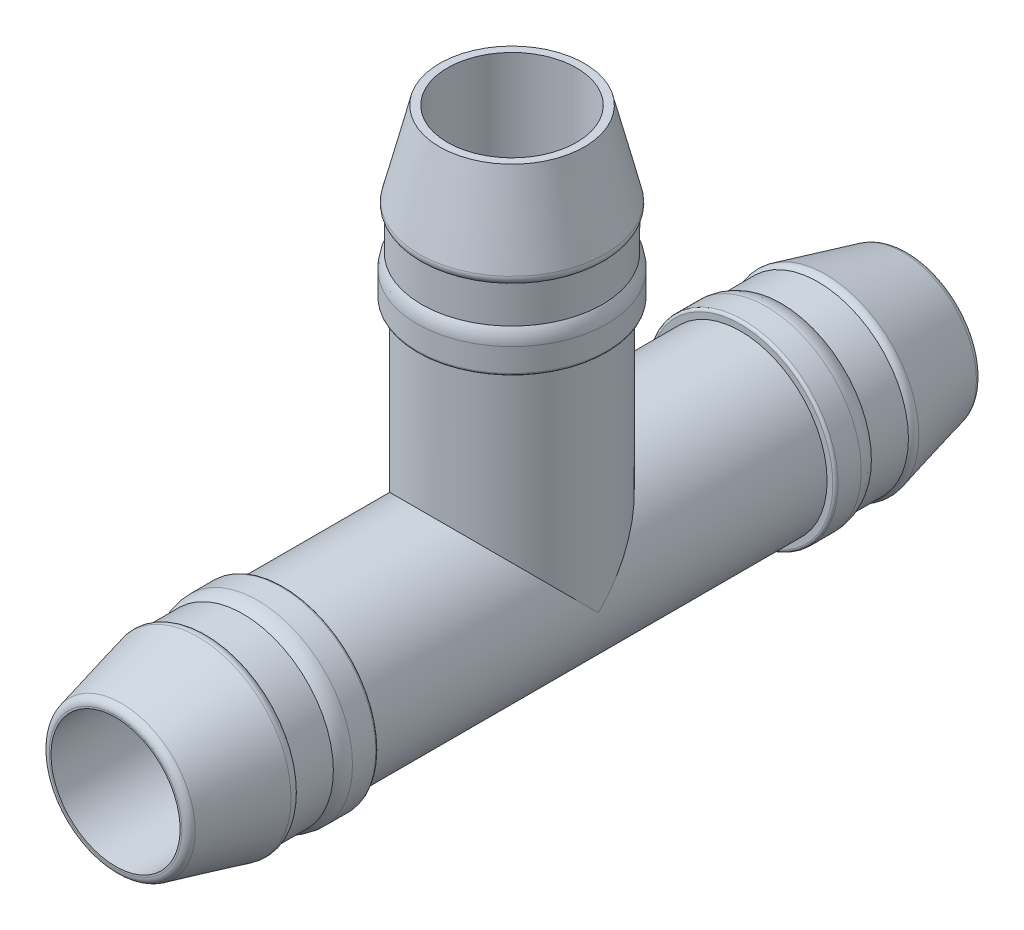
ISO-10303-21;
HEADER;
FILE_DESCRIPTION(('STEP AP214'),'2;1');
FILE_NAME('part.step','',(''),(''),'','','');
FILE_SCHEMA(('AUTOMOTIVE_DESIGN { 1 0 10303 214 1 1 1 1 }'));
ENDSEC;
DATA;
#1=APPLICATION_CONTEXT('core data for automotive mechanical design processes');
#2=APPLICATION_PROTOCOL_DEFINITION('international standard','automotive_design',2000,#1);
#3=PRODUCT_CONTEXT('',#1,'mechanical');
#4=PRODUCT('Part','Part','',(#3));
#5=PRODUCT_RELATED_PRODUCT_CATEGORY('part','',(#4));
#6=PRODUCT_DEFINITION_FORMATION('','',#4);
#7=PRODUCT_DEFINITION_CONTEXT('part definition',#1,'design');
#8=PRODUCT_DEFINITION('design','',#6,#7);
#9=PRODUCT_DEFINITION_SHAPE('','',#8);
#10=(LENGTH_UNIT() NAMED_UNIT(*) SI_UNIT(.MILLI.,.METRE.));
#11=(NAMED_UNIT(*) PLANE_ANGLE_UNIT() SI_UNIT($,.RADIAN.));
#12=(NAMED_UNIT(*) SI_UNIT($,.STERADIAN.) SOLID_ANGLE_UNIT());
#13=UNCERTAINTY_MEASURE_WITH_UNIT(LENGTH_MEASURE(1.E-05),#10,'distance_accuracy_value','');
#14=(GEOMETRIC_REPRESENTATION_CONTEXT(3) GLOBAL_UNCERTAINTY_ASSIGNED_CONTEXT((#13)) GLOBAL_UNIT_ASSIGNED_CONTEXT((#10,
#11,#12)) REPRESENTATION_CONTEXT('',''));
#15=CARTESIAN_POINT('',(0.,0.,0.));
#16=DIRECTION('',(0.,0.,1.));
#17=DIRECTION('',(1.,0.,0.));
#18=AXIS2_PLACEMENT_3D('',#15,#16,#17);
#19=CARTESIAN_POINT('',(0.,0.,-8.85));
#20=DIRECTION('',(0.,0.,1.));
#21=DIRECTION('',(1.,0.,0.));
#22=AXIS2_PLACEMENT_3D('',#19,#20,#21);
#23=CYLINDRICAL_SURFACE('',#22,3.35);
#24=CARTESIAN_POINT('',(0.,0.,-8.85));
#25=DIRECTION('',(0.,0.,1.));
#26=DIRECTION('',(1.,0.,0.));
#27=AXIS2_PLACEMENT_3D('',#24,#25,#26);
#28=CIRCLE('',#27,3.35);
#29=CARTESIAN_POINT('',(3.35,0.,-8.85));
#30=VERTEX_POINT('',#29);
#31=EDGE_CURVE('E91',#30,#30,#28,.T.);
#32=ORIENTED_EDGE('',*,*,#31,.T.);
#33=EDGE_LOOP('',(#32));
#34=FACE_BOUND('',#33,.T.);
#35=CARTESIAN_POINT('',(0.,0.,8.85));
#36=DIRECTION('',(0.,0.,1.));
#37=DIRECTION('',(1.,0.,0.));
#38=AXIS2_PLACEMENT_3D('',#35,#36,#37);
#39=CIRCLE('',#38,3.35);
#40=CARTESIAN_POINT('',(3.35,0.,8.85));
#41=VERTEX_POINT('',#40);
#42=EDGE_CURVE('E95',#41,#41,#39,.T.);
#43=ORIENTED_EDGE('',*,*,#42,.F.);
#44=EDGE_LOOP('',(#43));
#45=FACE_BOUND('',#44,.T.);
#46=CARTESIAN_POINT('',(0.,0.,0.));
#47=DIRECTION('',(0.,0.707106781186547,0.707106781186547));
#48=DIRECTION('',(0.,-0.707106781186547,0.707106781186547));
#49=AXIS2_PLACEMENT_3D('',#46,#47,#48);
#50=ELLIPSE('',#49,4.73761543394987,3.35);
#51=CARTESIAN_POINT('',(-3.35,0.,0.));
#52=VERTEX_POINT('',#51);
#53=CARTESIAN_POINT('',(3.35,0.,0.));
#54=VERTEX_POINT('',#53);
#55=EDGE_CURVE('E139',#52,#54,#50,.F.);
#56=ORIENTED_EDGE('',*,*,#55,.T.);
#57=CARTESIAN_POINT('',(0.,0.,0.));
#58=DIRECTION('',(0.,-0.707106781186547,0.707106781186547));
#59=DIRECTION('',(0.,0.707106781186547,0.707106781186547));
#60=AXIS2_PLACEMENT_3D('',#57,#58,#59);
#61=ELLIPSE('',#60,4.73761543394987,3.35);
#62=EDGE_CURVE('E54',#54,#52,#61,.T.);
#63=ORIENTED_EDGE('',*,*,#62,.T.);
#64=EDGE_LOOP('',(#56,#63));
#65=FACE_BOUND('',#64,.T.);
#66=ADVANCED_FACE('F33',(#34,#45,#65),#23,.T.);
#67=CARTESIAN_POINT('',(0.,0.,-9.85));
#68=DIRECTION('',(0.,0.,-1.));
#69=DIRECTION('',(-1.,0.,0.));
#70=AXIS2_PLACEMENT_3D('',#67,#68,#69);
#71=TOROIDAL_SURFACE('',#70,2.675,1.);
#72=CARTESIAN_POINT('',(0.,0.,-9.85));
#73=DIRECTION('',(0.,0.,-1.));
#74=DIRECTION('',(-1.,0.,0.));
#75=AXIS2_PLACEMENT_3D('',#72,#73,#74);
#76=CIRCLE('',#75,3.675);
#77=CARTESIAN_POINT('',(-3.675,0.,-9.85));
#78=VERTEX_POINT('',#77);
#79=EDGE_CURVE('E121',#78,#78,#76,.F.);
#80=ORIENTED_EDGE('',*,*,#79,.F.);
#81=EDGE_LOOP('',(#80));
#82=FACE_BOUND('',#81,.T.);
#83=CARTESIAN_POINT('',(0.,0.,-10.4151327277729));
#84=DIRECTION('',(0.,0.,1.));
#85=DIRECTION('',(1.,0.,0.));
#86=AXIS2_PLACEMENT_3D('',#83,#84,#85);
#87=CIRCLE('',#86,3.5);
#88=CARTESIAN_POINT('',(3.5,0.,-10.4151327277729));
#89=VERTEX_POINT('',#88);
#90=EDGE_CURVE('E88',#89,#89,#87,.F.);
#91=ORIENTED_EDGE('',*,*,#90,.F.);
#92=EDGE_LOOP('',(#91));
#93=FACE_BOUND('',#92,.T.);
#94=ADVANCED_FACE('F165',(#82,#93),#71,.T.);
#95=CARTESIAN_POINT('',(0.,0.,10.85));
#96=DIRECTION('',(0.,0.,-1.));
#97=DIRECTION('',(-1.,0.,0.));
#98=AXIS2_PLACEMENT_3D('',#95,#96,#97);
#99=CYLINDRICAL_SURFACE('',#98,3.675);
#100=CARTESIAN_POINT('',(0.,0.,8.95));
#101=DIRECTION('',(0.,0.,1.));
#102=DIRECTION('',(1.,0.,0.));
#103=AXIS2_PLACEMENT_3D('',#100,#101,#102);
#104=CIRCLE('',#103,3.675);
#105=CARTESIAN_POINT('',(3.675,0.,8.95));
#106=VERTEX_POINT('',#105);
#107=EDGE_CURVE('E115',#106,#106,#104,.T.);
#108=ORIENTED_EDGE('',*,*,#107,.T.);
#109=EDGE_LOOP('',(#108));
#110=FACE_BOUND('',#109,.T.);
#111=CARTESIAN_POINT('',(0.,0.,9.85));
#112=DIRECTION('',(0.,0.,1.));
#113=DIRECTION('',(1.,0.,0.));
#114=AXIS2_PLACEMENT_3D('',#111,#112,#113);
#115=CIRCLE('',#114,3.675);
#116=CARTESIAN_POINT('',(3.675,0.,9.85));
#117=VERTEX_POINT('',#116);
#118=EDGE_CURVE('E98',#117,#117,#115,.F.);
#119=ORIENTED_EDGE('',*,*,#118,.T.);
#120=EDGE_LOOP('',(#119));
#121=FACE_BOUND('',#120,.T.);
#122=ADVANCED_FACE('F171',(#110,#121),#99,.T.);
#123=CARTESIAN_POINT('',(0.,0.,8.85));
#124=DIRECTION('',(0.,0.,1.));
#125=DIRECTION('',(1.,0.,0.));
#126=AXIS2_PLACEMENT_3D('',#123,#124,#125);
#127=PLANE('',#126);
#128=CARTESIAN_POINT('',(0.,0.,8.85));
#129=DIRECTION('',(0.,0.,1.));
#130=DIRECTION('',(1.,0.,0.));
#131=AXIS2_PLACEMENT_3D('',#128,#129,#130);
#132=CIRCLE('',#131,3.575);
#133=CARTESIAN_POINT('',(3.575,0.,8.85));
#134=VERTEX_POINT('',#133);
#135=EDGE_CURVE('E118',#134,#134,#132,.F.);
#136=ORIENTED_EDGE('',*,*,#135,.T.);
#137=EDGE_LOOP('',(#136));
#138=FACE_BOUND('',#137,.T.);
#139=ORIENTED_EDGE('',*,*,#42,.T.);
#140=EDGE_LOOP('',(#139));
#141=FACE_BOUND('',#140,.T.);
#142=ADVANCED_FACE('F182',(#138,#141),#127,.F.);
#143=CARTESIAN_POINT('',(0.,0.,9.85));
#144=DIRECTION('',(0.,0.,1.));
#145=DIRECTION('',(1.,0.,0.));
#146=AXIS2_PLACEMENT_3D('',#143,#144,#145);
#147=TOROIDAL_SURFACE('',#146,2.675,1.);
#148=CARTESIAN_POINT('',(0.,0.,10.4151327277729));
#149=DIRECTION('',(0.,0.,-1.));
#150=DIRECTION('',(-1.,0.,0.));
#151=AXIS2_PLACEMENT_3D('',#148,#149,#150);
#152=CIRCLE('',#151,3.5);
#153=CARTESIAN_POINT('',(3.5,0.,10.4151327277729));
#154=VERTEX_POINT('',#153);
#155=EDGE_CURVE('E103',#154,#154,#152,.F.);
#156=ORIENTED_EDGE('',*,*,#155,.F.);
#157=EDGE_LOOP('',(#156));
#158=FACE_BOUND('',#157,.T.);
#159=ORIENTED_EDGE('',*,*,#118,.F.);
#160=EDGE_LOOP('',(#159));
#161=FACE_BOUND('',#160,.T.);
#162=ADVANCED_FACE('F178',(#158,#161),#147,.T.);
#163=CARTESIAN_POINT('',(0.,0.,-8.851));
#164=DIRECTION('',(0.,0.,1.));
#165=DIRECTION('',(1.,0.,0.));
#166=AXIS2_PLACEMENT_3D('',#163,#164,#165);
#167=CYLINDRICAL_SURFACE('',#166,3.5);
#168=CARTESIAN_POINT('',(0.,0.,11.85));
#169=DIRECTION('',(0.,0.,1.));
#170=DIRECTION('',(1.,0.,0.));
#171=AXIS2_PLACEMENT_3D('',#168,#169,#170);
#172=CIRCLE('',#171,3.5);
#173=CARTESIAN_POINT('',(3.5,0.,11.85));
#174=VERTEX_POINT('',#173);
#175=EDGE_CURVE('E92',#174,#174,#172,.T.);
#176=CARTESIAN_POINT('',(3.5,0.,10.4151327277729));
#177=CARTESIAN_POINT('',(3.5,0.,10.4300792618586));
#178=CARTESIAN_POINT('',(3.5,0.,10.4450257959443));
#179=CARTESIAN_POINT('',(3.5,0.,10.4749188641157));
#180=CARTESIAN_POINT('',(3.5,0.,10.4898653982014));
#181=CARTESIAN_POINT('',(3.5,0.,10.5197584663728));
#182=CARTESIAN_POINT('',(3.5,0.,10.5347050004585));
#183=CARTESIAN_POINT('',(3.5,0.,10.5645980686299));
#184=CARTESIAN_POINT('',(3.5,0.,10.5795446027156));
#185=CARTESIAN_POINT('',(3.5,0.,10.609437670887));
#186=CARTESIAN_POINT('',(3.5,0.,10.6243842049727));
#187=CARTESIAN_POINT('',(3.5,0.,10.6542772731441));
#188=CARTESIAN_POINT('',(3.5,0.,10.6692238072298));
#189=CARTESIAN_POINT('',(3.5,0.,10.6991168754012));
#190=CARTESIAN_POINT('',(3.5,0.,10.7140634094869));
#191=CARTESIAN_POINT('',(3.5,0.,10.7439564776583));
#192=CARTESIAN_POINT('',(3.5,0.,10.7589030117439));
#193=CARTESIAN_POINT('',(3.5,0.,10.7887960799153));
#194=CARTESIAN_POINT('',(3.5,0.,10.803742614001));
#195=CARTESIAN_POINT('',(3.5,0.,10.8336356821724));
#196=CARTESIAN_POINT('',(3.5,0.,10.8485822162581));
#197=CARTESIAN_POINT('',(3.5,0.,10.8784752844295));
#198=CARTESIAN_POINT('',(3.5,0.,10.8934218185152));
#199=CARTESIAN_POINT('',(3.5,0.,10.9233148866866));
#200=CARTESIAN_POINT('',(3.5,0.,10.9382614207723));
#201=CARTESIAN_POINT('',(3.5,0.,10.9681544889437));
#202=CARTESIAN_POINT('',(3.5,0.,10.9831010230294));
#203=CARTESIAN_POINT('',(3.5,0.,11.0129940912008));
#204=CARTESIAN_POINT('',(3.5,0.,11.0279406252865));
#205=CARTESIAN_POINT('',(3.5,0.,11.0578336934579));
#206=CARTESIAN_POINT('',(3.5,0.,11.0727802275436));
#207=CARTESIAN_POINT('',(3.5,0.,11.102673295715));
#208=CARTESIAN_POINT('',(3.5,0.,11.1176198298007));
#209=CARTESIAN_POINT('',(3.5,0.,11.1475128979721));
#210=CARTESIAN_POINT('',(3.5,0.,11.1624594320578));
#211=CARTESIAN_POINT('',(3.5,0.,11.1923525002292));
#212=CARTESIAN_POINT('',(3.5,0.,11.2072990343149));
#213=CARTESIAN_POINT('',(3.5,0.,11.2371921024863));
#214=CARTESIAN_POINT('',(3.5,0.,11.252138636572));
#215=CARTESIAN_POINT('',(3.5,0.,11.2820317047434));
#216=CARTESIAN_POINT('',(3.5,0.,11.2969782388291));
#217=CARTESIAN_POINT('',(3.5,0.,11.3268713070005));
#218=CARTESIAN_POINT('',(3.5,0.,11.3418178410862));
#219=CARTESIAN_POINT('',(3.5,0.,11.3717109092576));
#220=CARTESIAN_POINT('',(3.5,0.,11.3866574433433));
#221=CARTESIAN_POINT('',(3.5,0.,11.4165505115147));
#222=CARTESIAN_POINT('',(3.5,0.,11.4314970456004));
#223=CARTESIAN_POINT('',(3.5,0.,11.4613901137718));
#224=CARTESIAN_POINT('',(3.5,0.,11.4763366478575));
#225=CARTESIAN_POINT('',(3.5,0.,11.5062297160289));
#226=CARTESIAN_POINT('',(3.5,0.,11.5211762501146));
#227=CARTESIAN_POINT('',(3.5,0.,11.551069318286));
#228=CARTESIAN_POINT('',(3.5,0.,11.5660158523717));
#229=CARTESIAN_POINT('',(3.5,0.,11.5959089205431));
#230=CARTESIAN_POINT('',(3.5,0.,11.6108554546288));
#231=CARTESIAN_POINT('',(3.5,0.,11.6407485228002));
#232=CARTESIAN_POINT('',(3.5,0.,11.6556950568859));
#233=CARTESIAN_POINT('',(3.5,0.,11.6855881250573));
#234=CARTESIAN_POINT('',(3.5,0.,11.700534659143));
#235=CARTESIAN_POINT('',(3.5,0.,11.7304277273144));
#236=CARTESIAN_POINT('',(3.5,0.,11.7453742614001));
#237=CARTESIAN_POINT('',(3.5,0.,11.7752673295715));
#238=CARTESIAN_POINT('',(3.5,0.,11.7902138636572));
#239=CARTESIAN_POINT('',(3.5,0.,11.8201069318286));
#240=CARTESIAN_POINT('',(3.5,0.,11.8350534659143));
#241=CARTESIAN_POINT('',(3.5,0.,11.85));
#242=B_SPLINE_CURVE_WITH_KNOTS('',3,(#176,#177,#178,#179,#180,#181,#182,#183,#184,#185,#186,
#187,#188,#189,#190,#191,#192,#193,#194,#195,#196,#197,#198,#199,#200,#201,#202,#203,#204,#205,
#206,#207,#208,#209,#210,#211,#212,#213,#214,#215,#216,#217,#218,#219,#220,#221,#222,#223,#224,
#225,#226,#227,#228,#229,#230,#231,#232,#233,#234,#235,#236,#237,#238,#239,#240,#241),
.UNSPECIFIED.,.F.,.F.,(4,2,2,2,2,2,2,2,2,2,2,2,2,2,2,2,2,2,2,2,2,2,2,2,2,2,2,2,2,2,2,2,4),(0.,
0.0448396022570963,0.089679204514196,0.134518806771296,0.179358409028392,0.224198011285488,
0.269037613542588,0.313877215799688,0.358716818056784,0.40355642031388,0.44839602257098,
0.49323562482808,0.538075227085176,0.582914829342272,0.627754431599372,0.672594033856472,
0.717433636113568,0.762273238370664,0.807112840627764,0.851952442884864,0.89679204514196,
0.941631647399056,0.986471249656156,1.03131085191326,1.07615045417035,1.12099005642745,
1.16582965868455,1.21066926094165,1.25550886319874,1.30034846545584,1.34518806771294,
1.39002766997004,1.43486727222714),.UNSPECIFIED.);
#243=EDGE_CURVE('BSEAM181',#154,#174,#242,.T.);
#244=ORIENTED_EDGE('',*,*,#155,.T.);
#245=ORIENTED_EDGE('',*,*,#175,.F.);
#246=ORIENTED_EDGE('',*,*,#243,.T.);
#247=ORIENTED_EDGE('',*,*,#243,.F.);
#248=EDGE_LOOP('',(#244,#246,#245,#247));
#249=FACE_BOUND('',#248,.T.);
#250=ADVANCED_FACE('F181',(#249),#167,.T.);
#251=CARTESIAN_POINT('',(0.,0.,11.85));
#252=DIRECTION('',(0.,0.,-1.));
#253=DIRECTION('',(1.,0.,0.));
#254=AXIS2_PLACEMENT_3D('',#251,#252,#253);
#255=CONICAL_SURFACE('',#254,3.675,0.244346095279207);
#256=CARTESIAN_POINT('',(0.,0.,12.1533251530702));
#257=DIRECTION('',(0.,0.,1.));
#258=DIRECTION('',(1.,0.,0.));
#259=AXIS2_PLACEMENT_3D('',#256,#257,#258);
#260=CIRCLE('',#259,3.5993725453729);
#261=CARTESIAN_POINT('',(3.5993725453729,0.,12.1533251530702));
#262=VERTEX_POINT('',#261);
#263=EDGE_CURVE('E109',#262,#262,#260,.T.);
#264=ORIENTED_EDGE('',*,*,#263,.T.);
#265=EDGE_LOOP('',(#264));
#266=FACE_BOUND('',#265,.T.);
#267=CARTESIAN_POINT('',(0.,0.,15.1225765686799));
#268=DIRECTION('',(0.,0.,-1.));
#269=DIRECTION('',(-1.,0.,0.));
#270=AXIS2_PLACEMENT_3D('',#267,#268,#269);
#271=CIRCLE('',#270,2.85905501997965);
#272=CARTESIAN_POINT('',(-2.85905501997965,0.,15.1225765686799));
#273=VERTEX_POINT('',#272);
#274=EDGE_CURVE('E106',#273,#273,#271,.T.);
#275=ORIENTED_EDGE('',*,*,#274,.T.);
#276=EDGE_LOOP('',(#275));
#277=FACE_BOUND('',#276,.T.);
#278=ADVANCED_FACE('F258',(#266,#277),#255,.T.);
#279=CARTESIAN_POINT('',(0.,0.,15.35));
#280=DIRECTION('',(0.,0.,1.));
#281=DIRECTION('',(1.,0.,0.));
#282=AXIS2_PLACEMENT_3D('',#279,#280,#281);
#283=PLANE('',#282);
#284=CARTESIAN_POINT('',(0.,0.,15.35));
#285=DIRECTION('',(0.,0.,-1.));
#286=DIRECTION('',(-1.,0.,0.));
#287=AXIS2_PLACEMENT_3D('',#284,#285,#286);
#288=CIRCLE('',#287,2.5);
#289=CARTESIAN_POINT('',(-2.5,0.,15.35));
#290=VERTEX_POINT('',#289);
#291=EDGE_CURVE('E77',#290,#290,#288,.T.);
#292=ORIENTED_EDGE('',*,*,#291,.T.);
#293=EDGE_LOOP('',(#292));
#294=FACE_BOUND('',#293,.T.);
#295=CARTESIAN_POINT('',(0.,0.,15.35));
#296=DIRECTION('',(0.,0.,1.));
#297=DIRECTION('',(1.,0.,0.));
#298=AXIS2_PLACEMENT_3D('',#295,#296,#297);
#299=CIRCLE('',#298,2.56796630209685);
#300=CARTESIAN_POINT('',(2.56796630209685,0.,15.35));
#301=VERTEX_POINT('',#300);
#302=EDGE_CURVE('E112',#301,#301,#299,.T.);
#303=ORIENTED_EDGE('',*,*,#302,.T.);
#304=EDGE_LOOP('',(#303));
#305=FACE_BOUND('',#304,.T.);
#306=ADVANCED_FACE('F188',(#294,#305),#283,.T.);
#307=CARTESIAN_POINT('',(0.,0.,12.0807485843903));
#308=DIRECTION('',(0.,0.,-1.));
#309=DIRECTION('',(-1.,0.,0.));
#310=AXIS2_PLACEMENT_3D('',#307,#308,#309);
#311=TOROIDAL_SURFACE('',#310,3.3082838274901,0.3);
#312=ORIENTED_EDGE('',*,*,#175,.T.);
#313=EDGE_LOOP('',(#312));
#314=FACE_BOUND('',#313,.T.);
#315=ORIENTED_EDGE('',*,*,#263,.F.);
#316=EDGE_LOOP('',(#315));
#317=FACE_BOUND('',#316,.T.);
#318=ADVANCED_FACE('F184',(#314,#317),#311,.T.);
#319=CARTESIAN_POINT('',(0.,0.,15.05));
#320=DIRECTION('',(0.,0.,1.));
#321=DIRECTION('',(1.,0.,0.));
#322=AXIS2_PLACEMENT_3D('',#319,#320,#321);
#323=TOROIDAL_SURFACE('',#322,2.56796630209685,0.3);
#324=ORIENTED_EDGE('',*,*,#274,.F.);
#325=EDGE_LOOP('',(#324));
#326=FACE_BOUND('',#325,.T.);
#327=ORIENTED_EDGE('',*,*,#302,.F.);
#328=EDGE_LOOP('',(#327));
#329=FACE_BOUND('',#328,.T.);
#330=ADVANCED_FACE('F187',(#326,#329),#323,.T.);
#331=CARTESIAN_POINT('',(0.,0.,8.95));
#332=DIRECTION('',(0.,0.,1.));
#333=DIRECTION('',(1.,0.,0.));
#334=AXIS2_PLACEMENT_3D('',#331,#332,#333);
#335=TOROIDAL_SURFACE('',#334,3.575,0.1);
#336=ORIENTED_EDGE('',*,*,#135,.F.);
#337=EDGE_LOOP('',(#336));
#338=FACE_BOUND('',#337,.T.);
#339=ORIENTED_EDGE('',*,*,#107,.F.);
#340=EDGE_LOOP('',(#339));
#341=FACE_BOUND('',#340,.T.);
#342=ADVANCED_FACE('F192',(#338,#341),#335,.T.);
#343=CARTESIAN_POINT('',(0.,0.,-10.85));
#344=DIRECTION('',(0.,0.,1.));
#345=DIRECTION('',(1.,0.,0.));
#346=AXIS2_PLACEMENT_3D('',#343,#344,#345);
#347=CYLINDRICAL_SURFACE('',#346,3.675);
#348=CARTESIAN_POINT('',(0.,0.,-8.95));
#349=DIRECTION('',(0.,0.,-1.));
#350=DIRECTION('',(-1.,0.,0.));
#351=AXIS2_PLACEMENT_3D('',#348,#349,#350);
#352=CIRCLE('',#351,3.675);
#353=CARTESIAN_POINT('',(-3.675,0.,-8.95));
#354=VERTEX_POINT('',#353);
#355=EDGE_CURVE('E136',#354,#354,#352,.T.);
#356=ORIENTED_EDGE('',*,*,#355,.T.);
#357=EDGE_LOOP('',(#356));
#358=FACE_BOUND('',#357,.T.);
#359=ORIENTED_EDGE('',*,*,#79,.T.);
#360=EDGE_LOOP('',(#359));
#361=FACE_BOUND('',#360,.T.);
#362=ADVANCED_FACE('F195',(#358,#361),#347,.T.);
#363=CARTESIAN_POINT('',(0.,0.,-8.85));
#364=DIRECTION('',(0.,0.,-1.));
#365=DIRECTION('',(1.,0.,0.));
#366=AXIS2_PLACEMENT_3D('',#363,#364,#365);
#367=PLANE('',#366);
#368=CARTESIAN_POINT('',(0.,0.,-8.85));
#369=DIRECTION('',(0.,0.,-1.));
#370=DIRECTION('',(-1.,0.,0.));
#371=AXIS2_PLACEMENT_3D('',#368,#369,#370);
#372=CIRCLE('',#371,3.575);
#373=CARTESIAN_POINT('',(-3.575,0.,-8.85));
#374=VERTEX_POINT('',#373);
#375=EDGE_CURVE('E133',#374,#374,#372,.F.);
#376=ORIENTED_EDGE('',*,*,#375,.T.);
#377=EDGE_LOOP('',(#376));
#378=FACE_BOUND('',#377,.T.);
#379=ORIENTED_EDGE('',*,*,#31,.F.);
#380=EDGE_LOOP('',(#379));
#381=FACE_BOUND('',#380,.T.);
#382=ADVANCED_FACE('F248',(#378,#381),#367,.F.);
#383=CARTESIAN_POINT('',(0.,0.,15.351));
#384=DIRECTION('',(0.,0.,-1.));
#385=DIRECTION('',(-1.,0.,0.));
#386=AXIS2_PLACEMENT_3D('',#383,#384,#385);
#387=CYLINDRICAL_SURFACE('',#386,3.5);
#388=ORIENTED_EDGE('',*,*,#90,.T.);
#389=EDGE_LOOP('',(#388));
#390=FACE_BOUND('',#389,.T.);
#391=CARTESIAN_POINT('',(0.,0.,-11.85));
#392=DIRECTION('',(0.,0.,1.));
#393=DIRECTION('',(1.,0.,0.));
#394=AXIS2_PLACEMENT_3D('',#391,#392,#393);
#395=CIRCLE('',#394,3.5);
#396=CARTESIAN_POINT('',(3.5,0.,-11.85));
#397=VERTEX_POINT('',#396);
#398=EDGE_CURVE('E85',#397,#397,#395,.T.);
#399=ORIENTED_EDGE('',*,*,#398,.T.);
#400=EDGE_LOOP('',(#399));
#401=FACE_BOUND('',#400,.T.);
#402=ADVANCED_FACE('F244',(#390,#401),#387,.T.);
#403=CARTESIAN_POINT('',(0.,0.,-11.85));
#404=DIRECTION('',(0.,0.,1.));
#405=DIRECTION('',(1.,0.,0.));
#406=AXIS2_PLACEMENT_3D('',#403,#404,#405);
#407=CONICAL_SURFACE('',#406,3.675,0.244346095279207);
#408=CARTESIAN_POINT('',(0.,0.,-12.1533251530702));
#409=DIRECTION('',(0.,0.,1.));
#410=DIRECTION('',(1.,0.,0.));
#411=AXIS2_PLACEMENT_3D('',#408,#409,#410);
#412=CIRCLE('',#411,3.5993725453729);
#413=CARTESIAN_POINT('',(3.5993725453729,0.,-12.1533251530702));
#414=VERTEX_POINT('',#413);
#415=EDGE_CURVE('E127',#414,#414,#412,.F.);
#416=ORIENTED_EDGE('',*,*,#415,.T.);
#417=EDGE_LOOP('',(#416));
#418=FACE_BOUND('',#417,.T.);
#419=CARTESIAN_POINT('',(0.,0.,-15.1225765686799));
#420=DIRECTION('',(0.,0.,-1.));
#421=DIRECTION('',(-1.,0.,0.));
#422=AXIS2_PLACEMENT_3D('',#419,#420,#421);
#423=CIRCLE('',#422,2.85905501997965);
#424=CARTESIAN_POINT('',(-2.85905501997965,0.,-15.1225765686799));
#425=VERTEX_POINT('',#424);
#426=EDGE_CURVE('E124',#425,#425,#423,.F.);
#427=ORIENTED_EDGE('',*,*,#426,.T.);
#428=EDGE_LOOP('',(#427));
#429=FACE_BOUND('',#428,.T.);
#430=ADVANCED_FACE('F240',(#418,#429),#407,.T.);
#431=CARTESIAN_POINT('',(0.,0.,-15.35));
#432=DIRECTION('',(0.,0.,-1.));
#433=DIRECTION('',(1.,0.,0.));
#434=AXIS2_PLACEMENT_3D('',#431,#432,#433);
#435=PLANE('',#434);
#436=CARTESIAN_POINT('',(0.,0.,-15.35));
#437=DIRECTION('',(0.,0.,-1.));
#438=DIRECTION('',(-1.,0.,0.));
#439=AXIS2_PLACEMENT_3D('',#436,#437,#438);
#440=CIRCLE('',#439,2.5);
#441=CARTESIAN_POINT('',(-2.5,0.,-15.35));
#442=VERTEX_POINT('',#441);
#443=EDGE_CURVE('E76',#442,#442,#440,.T.);
#444=ORIENTED_EDGE('',*,*,#443,.F.);
#445=EDGE_LOOP('',(#444));
#446=FACE_BOUND('',#445,.T.);
#447=CARTESIAN_POINT('',(0.,0.,-15.35));
#448=DIRECTION('',(0.,0.,-1.));
#449=DIRECTION('',(-1.,0.,0.));
#450=AXIS2_PLACEMENT_3D('',#447,#448,#449);
#451=CIRCLE('',#450,2.56796630209685);
#452=CARTESIAN_POINT('',(-2.56796630209685,0.,-15.35));
#453=VERTEX_POINT('',#452);
#454=EDGE_CURVE('E130',#453,#453,#451,.T.);
#455=ORIENTED_EDGE('',*,*,#454,.T.);
#456=EDGE_LOOP('',(#455));
#457=FACE_BOUND('',#456,.T.);
#458=ADVANCED_FACE('F202',(#446,#457),#435,.T.);
#459=CARTESIAN_POINT('',(0.,0.,-12.0807485843903));
#460=DIRECTION('',(0.,0.,1.));
#461=DIRECTION('',(1.,0.,0.));
#462=AXIS2_PLACEMENT_3D('',#459,#460,#461);
#463=TOROIDAL_SURFACE('',#462,3.3082838274901,0.3);
#464=ORIENTED_EDGE('',*,*,#415,.F.);
#465=EDGE_LOOP('',(#464));
#466=FACE_BOUND('',#465,.T.);
#467=ORIENTED_EDGE('',*,*,#398,.F.);
#468=EDGE_LOOP('',(#467));
#469=FACE_BOUND('',#468,.T.);
#470=ADVANCED_FACE('F198',(#466,#469),#463,.T.);
#471=CARTESIAN_POINT('',(0.,0.,-15.05));
#472=DIRECTION('',(0.,0.,-1.));
#473=DIRECTION('',(-1.,0.,0.));
#474=AXIS2_PLACEMENT_3D('',#471,#472,#473);
#475=TOROIDAL_SURFACE('',#474,2.56796630209685,0.3);
#476=ORIENTED_EDGE('',*,*,#454,.F.);
#477=EDGE_LOOP('',(#476));
#478=FACE_BOUND('',#477,.T.);
#479=ORIENTED_EDGE('',*,*,#426,.F.);
#480=EDGE_LOOP('',(#479));
#481=FACE_BOUND('',#480,.T.);
#482=ADVANCED_FACE('F201',(#478,#481),#475,.T.);
#483=CARTESIAN_POINT('',(0.,0.,-8.95));
#484=DIRECTION('',(0.,0.,-1.));
#485=DIRECTION('',(-1.,0.,0.));
#486=AXIS2_PLACEMENT_3D('',#483,#484,#485);
#487=TOROIDAL_SURFACE('',#486,3.575,0.1);
#488=ORIENTED_EDGE('',*,*,#355,.F.);
#489=EDGE_LOOP('',(#488));
#490=FACE_BOUND('',#489,.T.);
#491=ORIENTED_EDGE('',*,*,#375,.F.);
#492=EDGE_LOOP('',(#491));
#493=FACE_BOUND('',#492,.T.);
#494=ADVANCED_FACE('F206',(#490,#493),#487,.T.);
#495=CARTESIAN_POINT('',(0.,8.85,0.));
#496=DIRECTION('',(0.,-1.,0.));
#497=DIRECTION('',(0.,0.,-1.));
#498=AXIS2_PLACEMENT_3D('',#495,#496,#497);
#499=CYLINDRICAL_SURFACE('',#498,3.35);
#500=ORIENTED_EDGE('',*,*,#62,.F.);
#501=ORIENTED_EDGE('',*,*,#55,.F.);
#502=EDGE_LOOP('',(#500,#501));
#503=FACE_BOUND('',#502,.T.);
#504=CARTESIAN_POINT('',(0.,8.85,0.));
#505=DIRECTION('',(0.,1.,0.));
#506=DIRECTION('',(0.,0.,1.));
#507=AXIS2_PLACEMENT_3D('',#504,#505,#506);
#508=CIRCLE('',#507,3.35);
#509=CARTESIAN_POINT('',(0.,8.85,3.35));
#510=VERTEX_POINT('',#509);
#511=EDGE_CURVE('E80',#510,#510,#508,.T.);
#512=ORIENTED_EDGE('',*,*,#511,.F.);
#513=EDGE_LOOP('',(#512));
#514=FACE_BOUND('',#513,.T.);
#515=ADVANCED_FACE('F210',(#503,#514),#499,.T.);
#516=CARTESIAN_POINT('',(0.,0.,15.35));
#517=DIRECTION('',(0.,0.,-1.));
#518=DIRECTION('',(-1.,0.,0.));
#519=AXIS2_PLACEMENT_3D('',#516,#517,#518);
#520=CYLINDRICAL_SURFACE('',#519,2.5);
#521=CARTESIAN_POINT('',(0.,0.,0.));
#522=DIRECTION('',(0.,0.707106781186547,0.707106781186547));
#523=DIRECTION('',(0.,0.707106781186547,-0.707106781186547));
#524=AXIS2_PLACEMENT_3D('',#521,#522,#523);
#525=ELLIPSE('',#524,3.53553390593274,2.5);
#526=CARTESIAN_POINT('',(-2.5,0.,0.));
#527=VERTEX_POINT('',#526);
#528=CARTESIAN_POINT('',(2.5,0.,0.));
#529=VERTEX_POINT('',#528);
#530=EDGE_CURVE('E59',#527,#529,#525,.F.);
#531=ORIENTED_EDGE('',*,*,#530,.F.);
#532=CARTESIAN_POINT('',(0.,0.,0.));
#533=DIRECTION('',(0.,0.707106781186547,-0.707106781186547));
#534=DIRECTION('',(0.,0.707106781186547,0.707106781186547));
#535=AXIS2_PLACEMENT_3D('',#532,#533,#534);
#536=ELLIPSE('',#535,3.53553390593274,2.5);
#537=EDGE_CURVE('E47',#529,#527,#536,.F.);
#538=ORIENTED_EDGE('',*,*,#537,.F.);
#539=EDGE_LOOP('',(#531,#538));
#540=FACE_BOUND('',#539,.T.);
#541=ORIENTED_EDGE('',*,*,#291,.F.);
#542=EDGE_LOOP('',(#541));
#543=FACE_BOUND('',#542,.T.);
#544=ORIENTED_EDGE('',*,*,#443,.T.);
#545=EDGE_LOOP('',(#544));
#546=FACE_BOUND('',#545,.T.);
#547=ADVANCED_FACE('F63',(#540,#543,#546),#520,.F.);
#548=CARTESIAN_POINT('',(0.,10.85,0.));
#549=DIRECTION('',(0.,-1.,0.));
#550=DIRECTION('',(0.,0.,-1.));
#551=AXIS2_PLACEMENT_3D('',#548,#549,#550);
#552=CYLINDRICAL_SURFACE('',#551,3.675);
#553=CARTESIAN_POINT('',(0.,8.95,0.));
#554=DIRECTION('',(0.,1.,0.));
#555=DIRECTION('',(0.,0.,1.));
#556=AXIS2_PLACEMENT_3D('',#553,#554,#555);
#557=CIRCLE('',#556,3.675);
#558=CARTESIAN_POINT('',(0.,8.95,3.675));
#559=VERTEX_POINT('',#558);
#560=EDGE_CURVE('E41',#559,#559,#557,.T.);
#561=ORIENTED_EDGE('',*,*,#560,.T.);
#562=EDGE_LOOP('',(#561));
#563=FACE_BOUND('',#562,.T.);
#564=CARTESIAN_POINT('',(0.,9.85,0.));
#565=DIRECTION('',(0.,1.,0.));
#566=DIRECTION('',(0.,0.,1.));
#567=AXIS2_PLACEMENT_3D('',#564,#565,#566);
#568=CIRCLE('',#567,3.675);
#569=CARTESIAN_POINT('',(0.,9.85,3.675));
#570=VERTEX_POINT('',#569);
#571=EDGE_CURVE('E142',#570,#570,#568,.F.);
#572=ORIENTED_EDGE('',*,*,#571,.T.);
#573=EDGE_LOOP('',(#572));
#574=FACE_BOUND('',#573,.T.);
#575=ADVANCED_FACE('F153',(#563,#574),#552,.T.);
#576=CARTESIAN_POINT('',(0.,8.85,0.));
#577=DIRECTION('',(0.,1.,0.));
#578=DIRECTION('',(0.,0.,1.));
#579=AXIS2_PLACEMENT_3D('',#576,#577,#578);
#580=PLANE('',#579);
#581=CARTESIAN_POINT('',(0.,8.85,0.));
#582=DIRECTION('',(0.,1.,0.));
#583=DIRECTION('',(0.,0.,1.));
#584=AXIS2_PLACEMENT_3D('',#581,#582,#583);
#585=CIRCLE('',#584,3.575);
#586=CARTESIAN_POINT('',(0.,8.85,3.575));
#587=VERTEX_POINT('',#586);
#588=EDGE_CURVE('E11',#587,#587,#585,.F.);
#589=ORIENTED_EDGE('',*,*,#588,.T.);
#590=EDGE_LOOP('',(#589));
#591=FACE_BOUND('',#590,.T.);
#592=ORIENTED_EDGE('',*,*,#511,.T.);
#593=EDGE_LOOP('',(#592));
#594=FACE_BOUND('',#593,.T.);
#595=ADVANCED_FACE('F215',(#591,#594),#580,.F.);
#596=CARTESIAN_POINT('',(0.,9.85,0.));
#597=DIRECTION('',(0.,1.,0.));
#598=DIRECTION('',(0.,0.,1.));
#599=AXIS2_PLACEMENT_3D('',#596,#597,#598);
#600=TOROIDAL_SURFACE('',#599,2.675,1.);
#601=CARTESIAN_POINT('',(0.,10.4151327277729,0.));
#602=DIRECTION('',(0.,-1.,0.));
#603=DIRECTION('',(0.,0.,-1.));
#604=AXIS2_PLACEMENT_3D('',#601,#602,#603);
#605=CIRCLE('',#604,3.5);
#606=CARTESIAN_POINT('',(0.,10.4151327277729,-3.5));
#607=VERTEX_POINT('',#606);
#608=EDGE_CURVE('E145',#607,#607,#605,.F.);
#609=ORIENTED_EDGE('',*,*,#608,.F.);
#610=EDGE_LOOP('',(#609));
#611=FACE_BOUND('',#610,.T.);
#612=ORIENTED_EDGE('',*,*,#571,.F.);
#613=EDGE_LOOP('',(#612));
#614=FACE_BOUND('',#613,.T.);
#615=ADVANCED_FACE('F212',(#611,#614),#600,.T.);
#616=CARTESIAN_POINT('',(0.,-3.676,0.));
#617=DIRECTION('',(0.,1.,0.));
#618=DIRECTION('',(0.,0.,1.));
#619=AXIS2_PLACEMENT_3D('',#616,#617,#618);
#620=CYLINDRICAL_SURFACE('',#619,3.5);
#621=ORIENTED_EDGE('',*,*,#608,.T.);
#622=EDGE_LOOP('',(#621));
#623=FACE_BOUND('',#622,.T.);
#624=CARTESIAN_POINT('',(0.,11.85,0.));
#625=DIRECTION('',(0.,1.,0.));
#626=DIRECTION('',(0.,0.,1.));
#627=AXIS2_PLACEMENT_3D('',#624,#625,#626);
#628=CIRCLE('',#627,3.5);
#629=CARTESIAN_POINT('',(0.,11.85,3.5));
#630=VERTEX_POINT('',#629);
#631=EDGE_CURVE('E73',#630,#630,#628,.T.);
#632=ORIENTED_EDGE('',*,*,#631,.F.);
#633=EDGE_LOOP('',(#632));
#634=FACE_BOUND('',#633,.T.);
#635=ADVANCED_FACE('F214',(#623,#634),#620,.T.);
#636=CARTESIAN_POINT('',(0.,11.85,0.));
#637=DIRECTION('',(0.,-1.,0.));
#638=DIRECTION('',(0.,0.,1.));
#639=AXIS2_PLACEMENT_3D('',#636,#637,#638);
#640=CONICAL_SURFACE('',#639,3.675,0.244346095279207);
#641=CARTESIAN_POINT('',(0.,12.1533251530703,0.));
#642=DIRECTION('',(0.,1.,0.));
#643=DIRECTION('',(0.,0.,1.));
#644=AXIS2_PLACEMENT_3D('',#641,#642,#643);
#645=CIRCLE('',#644,3.59937254537288);
#646=CARTESIAN_POINT('',(0.,12.1533251530703,3.59937254537288));
#647=VERTEX_POINT('',#646);
#648=EDGE_CURVE('E148',#647,#647,#645,.T.);
#649=ORIENTED_EDGE('',*,*,#648,.T.);
#650=EDGE_LOOP('',(#649));
#651=FACE_BOUND('',#650,.T.);
#652=CARTESIAN_POINT('',(0.,15.35,0.));
#653=DIRECTION('',(0.,1.,0.));
#654=DIRECTION('',(0.,0.,1.));
#655=AXIS2_PLACEMENT_3D('',#652,#653,#654);
#656=CIRCLE('',#655,2.80235199004887);
#657=CARTESIAN_POINT('',(0.,15.35,2.80235199004887));
#658=VERTEX_POINT('',#657);
#659=EDGE_CURVE('E68',#658,#658,#656,.T.);
#660=ORIENTED_EDGE('',*,*,#659,.F.);
#661=EDGE_LOOP('',(#660));
#662=FACE_BOUND('',#661,.T.);
#663=ADVANCED_FACE('F221',(#651,#662),#640,.T.);
#664=CARTESIAN_POINT('',(0.,15.35,0.));
#665=DIRECTION('',(0.,1.,0.));
#666=DIRECTION('',(0.,0.,1.));
#667=AXIS2_PLACEMENT_3D('',#664,#665,#666);
#668=PLANE('',#667);
#669=CARTESIAN_POINT('',(0.,15.35,0.));
#670=DIRECTION('',(0.,1.,0.));
#671=DIRECTION('',(0.,0.,1.));
#672=AXIS2_PLACEMENT_3D('',#669,#670,#671);
#673=CIRCLE('',#672,2.5);
#674=CARTESIAN_POINT('',(0.,15.35,2.5));
#675=VERTEX_POINT('',#674);
#676=EDGE_CURVE('E65',#675,#675,#673,.T.);
#677=ORIENTED_EDGE('',*,*,#676,.F.);
#678=EDGE_LOOP('',(#677));
#679=FACE_BOUND('',#678,.T.);
#680=ORIENTED_EDGE('',*,*,#659,.T.);
#681=EDGE_LOOP('',(#680));
#682=FACE_BOUND('',#681,.T.);
#683=ADVANCED_FACE('F384',(#679,#682),#668,.T.);
#684=CARTESIAN_POINT('',(0.,-3.676,0.));
#685=DIRECTION('',(0.,1.,0.));
#686=DIRECTION('',(0.,0.,1.));
#687=AXIS2_PLACEMENT_3D('',#684,#685,#686);
#688=CYLINDRICAL_SURFACE('',#687,2.5);
#689=ORIENTED_EDGE('',*,*,#676,.T.);
#690=EDGE_LOOP('',(#689));
#691=FACE_BOUND('',#690,.T.);
#692=ORIENTED_EDGE('',*,*,#537,.T.);
#693=ORIENTED_EDGE('',*,*,#530,.T.);
#694=EDGE_LOOP('',(#692,#693));
#695=FACE_BOUND('',#694,.T.);
#696=ADVANCED_FACE('F60',(#691,#695),#688,.F.);
#697=CARTESIAN_POINT('',(0.,12.0807485843904,0.));
#698=DIRECTION('',(0.,-1.,0.));
#699=DIRECTION('',(0.,0.,-1.));
#700=AXIS2_PLACEMENT_3D('',#697,#698,#699);
#701=TOROIDAL_SURFACE('',#700,3.30828382749009,0.3);
#702=ORIENTED_EDGE('',*,*,#631,.T.);
#703=EDGE_LOOP('',(#702));
#704=FACE_BOUND('',#703,.T.);
#705=ORIENTED_EDGE('',*,*,#648,.F.);
#706=EDGE_LOOP('',(#705));
#707=FACE_BOUND('',#706,.T.);
#708=ADVANCED_FACE('F157',(#704,#707),#701,.T.);
#709=CARTESIAN_POINT('',(0.,8.95,0.));
#710=DIRECTION('',(0.,1.,0.));
#711=DIRECTION('',(0.,0.,1.));
#712=AXIS2_PLACEMENT_3D('',#709,#710,#711);
#713=TOROIDAL_SURFACE('',#712,3.575,0.1);
#714=ORIENTED_EDGE('',*,*,#588,.F.);
#715=EDGE_LOOP('',(#714));
#716=FACE_BOUND('',#715,.T.);
#717=ORIENTED_EDGE('',*,*,#560,.F.);
#718=EDGE_LOOP('',(#717));
#719=FACE_BOUND('',#718,.T.);
#720=ADVANCED_FACE('F35',(#716,#719),#713,.T.);
#721=CLOSED_SHELL('',(#66,#94,#122,#142,#162,#250,#278,#306,#318,#330,#342,#362,#382,#402,#430,
#458,#470,#482,#494,#515,#547,#575,#595,#615,#635,#663,#683,#696,#708,#720));
#722=MANIFOLD_SOLID_BREP('B2',#721);
#723=ADVANCED_BREP_SHAPE_REPRESENTATION('',(#18,#722),#14);
#724=SHAPE_DEFINITION_REPRESENTATION(#9,#723);
ENDSEC;
END-ISO-10303-21;
